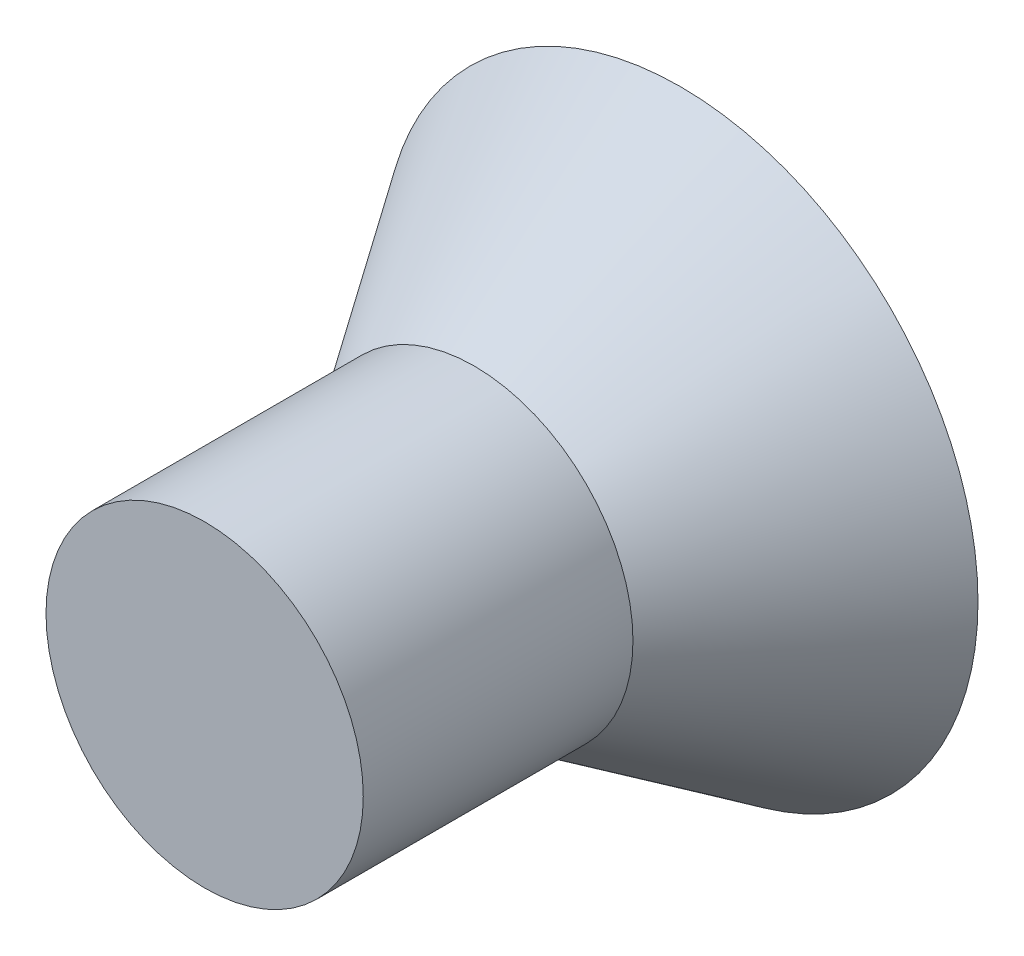
ISO-10303-21;
HEADER;
FILE_DESCRIPTION(('STEP AP214'),'2;1');
FILE_NAME('part.step','',(''),(''),'','','');
FILE_SCHEMA(('AUTOMOTIVE_DESIGN { 1 0 10303 214 1 1 1 1 }'));
ENDSEC;
DATA;
#1=APPLICATION_CONTEXT('core data for automotive mechanical design processes');
#2=APPLICATION_PROTOCOL_DEFINITION('international standard','automotive_design',2000,#1);
#3=PRODUCT_CONTEXT('',#1,'mechanical');
#4=PRODUCT('Part','Part','',(#3));
#5=PRODUCT_RELATED_PRODUCT_CATEGORY('part','',(#4));
#6=PRODUCT_DEFINITION_FORMATION('','',#4);
#7=PRODUCT_DEFINITION_CONTEXT('part definition',#1,'design');
#8=PRODUCT_DEFINITION('design','',#6,#7);
#9=PRODUCT_DEFINITION_SHAPE('','',#8);
#10=(LENGTH_UNIT() NAMED_UNIT(*) SI_UNIT(.MILLI.,.METRE.));
#11=(NAMED_UNIT(*) PLANE_ANGLE_UNIT() SI_UNIT($,.RADIAN.));
#12=(NAMED_UNIT(*) SI_UNIT($,.STERADIAN.) SOLID_ANGLE_UNIT());
#13=UNCERTAINTY_MEASURE_WITH_UNIT(LENGTH_MEASURE(1.E-05),#10,'distance_accuracy_value','');
#14=(GEOMETRIC_REPRESENTATION_CONTEXT(3) GLOBAL_UNCERTAINTY_ASSIGNED_CONTEXT((#13)) GLOBAL_UNIT_ASSIGNED_CONTEXT((#10,
#11,#12)) REPRESENTATION_CONTEXT('',''));
#15=CARTESIAN_POINT('',(0.,0.,0.));
#16=DIRECTION('',(0.,0.,1.));
#17=DIRECTION('',(1.,0.,0.));
#18=AXIS2_PLACEMENT_3D('',#15,#16,#17);
#19=CARTESIAN_POINT('',(0.,0.,6.));
#20=DIRECTION('',(0.,0.,-1.));
#21=DIRECTION('',(-1.,0.,0.));
#22=AXIS2_PLACEMENT_3D('',#19,#20,#21);
#23=CYLINDRICAL_SURFACE('',#22,2.);
#24=CARTESIAN_POINT('',(0.,0.,2.6));
#25=DIRECTION('',(0.,0.,-1.));
#26=DIRECTION('',(-1.,0.,0.));
#27=AXIS2_PLACEMENT_3D('',#24,#25,#26);
#28=CIRCLE('',#27,2.);
#29=CARTESIAN_POINT('',(-2.,0.,2.6));
#30=VERTEX_POINT('',#29);
#31=EDGE_CURVE('E38',#30,#30,#28,.F.);
#32=ORIENTED_EDGE('',*,*,#31,.T.);
#33=EDGE_LOOP('',(#32));
#34=FACE_BOUND('',#33,.T.);
#35=CARTESIAN_POINT('',(0.,0.,6.));
#36=DIRECTION('',(0.,0.,1.));
#37=DIRECTION('',(1.,0.,0.));
#38=AXIS2_PLACEMENT_3D('',#35,#36,#37);
#39=CIRCLE('',#38,2.);
#40=CARTESIAN_POINT('',(2.,0.,6.));
#41=VERTEX_POINT('',#40);
#42=EDGE_CURVE('E10',#41,#41,#39,.T.);
#43=ORIENTED_EDGE('',*,*,#42,.F.);
#44=EDGE_LOOP('',(#43));
#45=FACE_BOUND('',#44,.T.);
#46=ADVANCED_FACE('F35',(#34,#45),#23,.T.);
#47=CARTESIAN_POINT('',(0.,0.,6.));
#48=DIRECTION('',(0.,0.,1.));
#49=DIRECTION('',(1.,0.,0.));
#50=AXIS2_PLACEMENT_3D('',#47,#48,#49);
#51=PLANE('',#50);
#52=ORIENTED_EDGE('',*,*,#42,.T.);
#53=EDGE_LOOP('',(#52));
#54=FACE_BOUND('',#53,.T.);
#55=ADVANCED_FACE('F58',(#54),#51,.T.);
#56=CARTESIAN_POINT('',(0.,0.,5.57142857142857));
#57=DIRECTION('',(0.,0.,-1.));
#58=DIRECTION('',(-1.,0.,0.));
#59=AXIS2_PLACEMENT_3D('',#56,#57,#58);
#60=CONICAL_SURFACE('',#59,0.,0.592427353431878);
#61=CARTESIAN_POINT('',(0.,0.,0.));
#62=DIRECTION('',(0.,0.,1.));
#63=DIRECTION('',(1.,0.,0.));
#64=AXIS2_PLACEMENT_3D('',#61,#62,#63);
#65=CIRCLE('',#64,3.75);
#66=CARTESIAN_POINT('',(3.75,0.,0.));
#67=VERTEX_POINT('',#66);
#68=EDGE_CURVE('E45',#67,#67,#65,.T.);
#69=ORIENTED_EDGE('',*,*,#68,.T.);
#70=EDGE_LOOP('',(#69));
#71=FACE_BOUND('',#70,.T.);
#72=ORIENTED_EDGE('',*,*,#31,.F.);
#73=EDGE_LOOP('',(#72));
#74=FACE_BOUND('',#73,.T.);
#75=ADVANCED_FACE('F50',(#71,#74),#60,.T.);
#76=CARTESIAN_POINT('',(0.,0.,0.));
#77=DIRECTION('',(0.,0.,1.));
#78=DIRECTION('',(1.,0.,0.));
#79=AXIS2_PLACEMENT_3D('',#76,#77,#78);
#80=PLANE('',#79);
#81=ORIENTED_EDGE('',*,*,#68,.F.);
#82=EDGE_LOOP('',(#81));
#83=FACE_BOUND('',#82,.T.);
#84=ADVANCED_FACE('F53',(#83),#80,.F.);
#85=CLOSED_SHELL('',(#46,#55,#75,#84));
#86=MANIFOLD_SOLID_BREP('B2',#85);
#87=ADVANCED_BREP_SHAPE_REPRESENTATION('',(#18,#86),#14);
#88=SHAPE_DEFINITION_REPRESENTATION(#9,#87);
ENDSEC;
END-ISO-10303-21;
